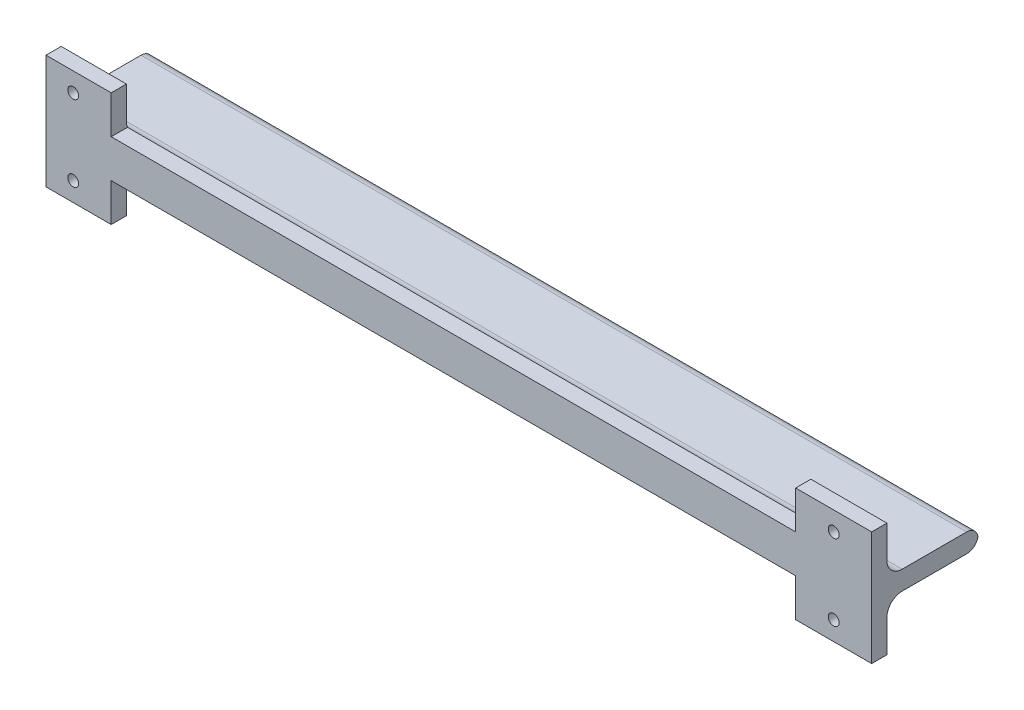
ISO-10303-21;
HEADER;
FILE_DESCRIPTION(('STEP AP214'),'2;1');
FILE_NAME('part.step','',(''),(''),'','','');
FILE_SCHEMA(('AUTOMOTIVE_DESIGN { 1 0 10303 214 1 1 1 1 }'));
ENDSEC;
DATA;
#1=APPLICATION_CONTEXT('core data for automotive mechanical design processes');
#2=APPLICATION_PROTOCOL_DEFINITION('international standard','automotive_design',2000,#1);
#3=PRODUCT_CONTEXT('',#1,'mechanical');
#4=PRODUCT('Part','Part','',(#3));
#5=PRODUCT_RELATED_PRODUCT_CATEGORY('part','',(#4));
#6=PRODUCT_DEFINITION_FORMATION('','',#4);
#7=PRODUCT_DEFINITION_CONTEXT('part definition',#1,'design');
#8=PRODUCT_DEFINITION('design','',#6,#7);
#9=PRODUCT_DEFINITION_SHAPE('','',#8);
#10=(LENGTH_UNIT() NAMED_UNIT(*) SI_UNIT(.MILLI.,.METRE.));
#11=(NAMED_UNIT(*) PLANE_ANGLE_UNIT() SI_UNIT($,.RADIAN.));
#12=(NAMED_UNIT(*) SI_UNIT($,.STERADIAN.) SOLID_ANGLE_UNIT());
#13=UNCERTAINTY_MEASURE_WITH_UNIT(LENGTH_MEASURE(1.E-05),#10,'distance_accuracy_value','');
#14=(GEOMETRIC_REPRESENTATION_CONTEXT(3) GLOBAL_UNCERTAINTY_ASSIGNED_CONTEXT((#13)) GLOBAL_UNIT_ASSIGNED_CONTEXT((#10,
#11,#12)) REPRESENTATION_CONTEXT('',''));
#15=CARTESIAN_POINT('',(0.,0.,0.));
#16=DIRECTION('',(0.,0.,1.));
#17=DIRECTION('',(1.,0.,0.));
#18=AXIS2_PLACEMENT_3D('',#15,#16,#17);
#19=CARTESIAN_POINT('',(0.,0.,-4.));
#20=DIRECTION('',(0.,0.,-1.));
#21=DIRECTION('',(-1.,0.,0.));
#22=AXIS2_PLACEMENT_3D('',#19,#20,#21);
#23=PLANE('',#22);
#24=CARTESIAN_POINT('',(-100.,-9.99999999999998,-4.));
#25=DIRECTION('',(0.,0.,1.));
#26=DIRECTION('',(1.,0.,0.));
#27=AXIS2_PLACEMENT_3D('',#24,#25,#26);
#28=CIRCLE('',#27,1.425);
#29=CARTESIAN_POINT('',(-98.575,-9.99999999999998,-4.));
#30=VERTEX_POINT('',#29);
#31=EDGE_CURVE('E478',#30,#30,#28,.T.);
#32=ORIENTED_EDGE('',*,*,#31,.T.);
#33=EDGE_LOOP('',(#32));
#34=FACE_BOUND('',#33,.T.);
#35=DIRECTION('',(0.,-1.,0.));
#36=VECTOR('',#35,1.);
#37=CARTESIAN_POINT('',(-107.15,-15.,-4.));
#38=LINE('',#37,#36);
#39=CARTESIAN_POINT('',(-107.15,-6.49999999999999,-4.));
#40=VERTEX_POINT('',#39);
#41=CARTESIAN_POINT('',(-107.15,-15.,-4.));
#42=VERTEX_POINT('',#41);
#43=EDGE_CURVE('E226',#40,#42,#38,.T.);
#44=ORIENTED_EDGE('',*,*,#43,.F.);
#45=DIRECTION('',(-1.,0.,0.));
#46=VECTOR('',#45,1.);
#47=CARTESIAN_POINT('',(0.,-6.49999999999999,-4.));
#48=LINE('',#47,#46);
#49=CARTESIAN_POINT('',(-90.,-6.49999999999999,-4.));
#50=VERTEX_POINT('',#49);
#51=EDGE_CURVE('E338',#40,#50,#48,.F.);
#52=ORIENTED_EDGE('',*,*,#51,.T.);
#53=DIRECTION('',(0.,1.,0.));
#54=VECTOR('',#53,1.);
#55=CARTESIAN_POINT('',(-90.,-5.00000000000007,-4.));
#56=LINE('',#55,#54);
#57=CARTESIAN_POINT('',(-90.,-15.,-4.));
#58=VERTEX_POINT('',#57);
#59=EDGE_CURVE('E235',#58,#50,#56,.T.);
#60=ORIENTED_EDGE('',*,*,#59,.F.);
#61=DIRECTION('',(1.,0.,0.));
#62=VECTOR('',#61,1.);
#63=CARTESIAN_POINT('',(-90.,-15.,-4.));
#64=LINE('',#63,#62);
#65=EDGE_CURVE('E231',#42,#58,#64,.T.);
#66=ORIENTED_EDGE('',*,*,#65,.F.);
#67=EDGE_LOOP('',(#44,#52,#60,#66));
#68=FACE_BOUND('',#67,.T.);
#69=ADVANCED_FACE('F39',(#34,#68),#23,.T.);
#70=CARTESIAN_POINT('',(100.,9.99999999999998,-4.));
#71=DIRECTION('',(0.,0.,1.));
#72=DIRECTION('',(1.,0.,0.));
#73=AXIS2_PLACEMENT_3D('',#70,#71,#72);
#74=CIRCLE('',#73,1.425);
#75=CARTESIAN_POINT('',(101.425,9.99999999999998,-4.));
#76=VERTEX_POINT('',#75);
#77=EDGE_CURVE('E253',#76,#76,#74,.T.);
#78=ORIENTED_EDGE('',*,*,#77,.T.);
#79=EDGE_LOOP('',(#78));
#80=FACE_BOUND('',#79,.T.);
#81=DIRECTION('',(0.,1.,0.));
#82=VECTOR('',#81,1.);
#83=CARTESIAN_POINT('',(110.,15.,-4.));
#84=LINE('',#83,#82);
#85=CARTESIAN_POINT('',(110.,6.49999999999999,-4.));
#86=VERTEX_POINT('',#85);
#87=CARTESIAN_POINT('',(110.,15.,-4.));
#88=VERTEX_POINT('',#87);
#89=EDGE_CURVE('E246',#86,#88,#84,.T.);
#90=ORIENTED_EDGE('',*,*,#89,.F.);
#91=DIRECTION('',(1.,0.,0.));
#92=VECTOR('',#91,1.);
#93=CARTESIAN_POINT('',(0.,6.5,-4.));
#94=LINE('',#93,#92);
#95=CARTESIAN_POINT('',(90.,6.5,-4.));
#96=VERTEX_POINT('',#95);
#97=EDGE_CURVE('E202',#86,#96,#94,.F.);
#98=ORIENTED_EDGE('',*,*,#97,.T.);
#99=DIRECTION('',(0.,-1.,0.));
#100=VECTOR('',#99,1.);
#101=CARTESIAN_POINT('',(90.,15.,-4.));
#102=LINE('',#101,#100);
#103=CARTESIAN_POINT('',(90.,15.,-4.));
#104=VERTEX_POINT('',#103);
#105=EDGE_CURVE('E184',#104,#96,#102,.T.);
#106=ORIENTED_EDGE('',*,*,#105,.F.);
#107=DIRECTION('',(-1.,0.,0.));
#108=VECTOR('',#107,1.);
#109=CARTESIAN_POINT('',(90.,15.,-4.));
#110=LINE('',#109,#108);
#111=EDGE_CURVE('E200',#88,#104,#110,.T.);
#112=ORIENTED_EDGE('',*,*,#111,.F.);
#113=EDGE_LOOP('',(#90,#98,#106,#112));
#114=FACE_BOUND('',#113,.T.);
#115=ADVANCED_FACE('F199',(#80,#114),#23,.T.);
#116=DIRECTION('',(0.,-1.,0.));
#117=VECTOR('',#116,1.);
#118=CARTESIAN_POINT('',(90.,-15.,-4.));
#119=LINE('',#118,#117);
#120=CARTESIAN_POINT('',(90.,-6.49999999999999,-4.));
#121=VERTEX_POINT('',#120);
#122=CARTESIAN_POINT('',(90.,-15.,-4.));
#123=VERTEX_POINT('',#122);
#124=EDGE_CURVE('E239',#121,#123,#119,.T.);
#125=ORIENTED_EDGE('',*,*,#124,.F.);
#126=DIRECTION('',(-1.,0.,0.));
#127=VECTOR('',#126,1.);
#128=CARTESIAN_POINT('',(0.,-6.49999999999999,-4.));
#129=LINE('',#128,#127);
#130=CARTESIAN_POINT('',(110.,-6.49999999999998,-4.));
#131=VERTEX_POINT('',#130);
#132=EDGE_CURVE('E335',#121,#131,#129,.F.);
#133=ORIENTED_EDGE('',*,*,#132,.T.);
#134=CARTESIAN_POINT('',(110.,-15.,-4.));
#135=VERTEX_POINT('',#134);
#136=EDGE_CURVE('E194',#135,#131,#84,.T.);
#137=ORIENTED_EDGE('',*,*,#136,.F.);
#138=DIRECTION('',(1.,0.,0.));
#139=VECTOR('',#138,1.);
#140=CARTESIAN_POINT('',(110.,-15.,-4.));
#141=LINE('',#140,#139);
#142=EDGE_CURVE('E242',#123,#135,#141,.T.);
#143=ORIENTED_EDGE('',*,*,#142,.F.);
#144=EDGE_LOOP('',(#125,#133,#137,#143));
#145=FACE_BOUND('',#144,.T.);
#146=CARTESIAN_POINT('',(100.,-9.99999999999998,-4.));
#147=DIRECTION('',(0.,0.,1.));
#148=DIRECTION('',(1.,0.,0.));
#149=AXIS2_PLACEMENT_3D('',#146,#147,#148);
#150=CIRCLE('',#149,1.425);
#151=CARTESIAN_POINT('',(101.425,-9.99999999999998,-4.));
#152=VERTEX_POINT('',#151);
#153=EDGE_CURVE('E486',#152,#152,#150,.T.);
#154=ORIENTED_EDGE('',*,*,#153,.T.);
#155=EDGE_LOOP('',(#154));
#156=FACE_BOUND('',#155,.T.);
#157=ADVANCED_FACE('F513',(#145,#156),#23,.T.);
#158=CARTESIAN_POINT('',(90.,15.,-4.));
#159=DIRECTION('',(0.,1.,0.));
#160=DIRECTION('',(0.,0.,1.));
#161=AXIS2_PLACEMENT_3D('',#158,#159,#160);
#162=PLANE('',#161);
#163=DIRECTION('',(-1.,0.,0.));
#164=VECTOR('',#163,1.);
#165=CARTESIAN_POINT('',(90.,15.,0.));
#166=LINE('',#165,#164);
#167=CARTESIAN_POINT('',(110.,15.,0.));
#168=VERTEX_POINT('',#167);
#169=CARTESIAN_POINT('',(90.,15.,0.));
#170=VERTEX_POINT('',#169);
#171=EDGE_CURVE('E250',#168,#170,#166,.T.);
#172=ORIENTED_EDGE('',*,*,#171,.F.);
#173=DIRECTION('',(0.,0.,1.));
#174=VECTOR('',#173,1.);
#175=CARTESIAN_POINT('',(110.,15.,-4.));
#176=LINE('',#175,#174);
#177=EDGE_CURVE('E208',#88,#168,#176,.T.);
#178=ORIENTED_EDGE('',*,*,#177,.F.);
#179=ORIENTED_EDGE('',*,*,#111,.T.);
#180=DIRECTION('',(0.,0.,1.));
#181=VECTOR('',#180,1.);
#182=CARTESIAN_POINT('',(90.,15.,-4.));
#183=LINE('',#182,#181);
#184=EDGE_CURVE('E180',#104,#170,#183,.T.);
#185=ORIENTED_EDGE('',*,*,#184,.T.);
#186=EDGE_LOOP('',(#172,#178,#179,#185));
#187=FACE_BOUND('',#186,.T.);
#188=ADVANCED_FACE('F207',(#187),#162,.T.);
#189=CARTESIAN_POINT('',(110.,15.,-4.));
#190=DIRECTION('',(1.,0.,0.));
#191=DIRECTION('',(0.,0.,-1.));
#192=AXIS2_PLACEMENT_3D('',#189,#190,#191);
#193=PLANE('',#192);
#194=DIRECTION('',(0.,0.,1.));
#195=VECTOR('',#194,1.);
#196=CARTESIAN_POINT('',(110.,-2.49999999999999,-28.));
#197=LINE('',#196,#195);
#198=CARTESIAN_POINT('',(110.,-2.49999999999999,-25.));
#199=VERTEX_POINT('',#198);
#200=CARTESIAN_POINT('',(110.,-2.49999999999999,-8.));
#201=VERTEX_POINT('',#200);
#202=EDGE_CURVE('E463',#199,#201,#197,.T.);
#203=ORIENTED_EDGE('',*,*,#202,.F.);
#204=CARTESIAN_POINT('',(110.,0.500000000000013,-25.));
#205=DIRECTION('',(1.,0.,0.));
#206=DIRECTION('',(0.,0.,-1.));
#207=AXIS2_PLACEMENT_3D('',#204,#205,#206);
#208=CIRCLE('',#207,3.);
#209=CARTESIAN_POINT('',(110.,0.,-27.9580398915498));
#210=VERTEX_POINT('',#209);
#211=EDGE_CURVE('E49',#199,#210,#208,.T.);
#212=ORIENTED_EDGE('',*,*,#211,.T.);
#213=CARTESIAN_POINT('',(110.,-0.500000000000013,-25.));
#214=DIRECTION('',(1.,0.,0.));
#215=DIRECTION('',(0.,0.,-1.));
#216=AXIS2_PLACEMENT_3D('',#213,#214,#215);
#217=CIRCLE('',#216,3.);
#218=CARTESIAN_POINT('',(110.,2.49999999999999,-25.));
#219=VERTEX_POINT('',#218);
#220=EDGE_CURVE('E59',#210,#219,#217,.T.);
#221=ORIENTED_EDGE('',*,*,#220,.T.);
#222=DIRECTION('',(0.,0.,1.));
#223=VECTOR('',#222,1.);
#224=CARTESIAN_POINT('',(110.,2.49999999999999,-28.));
#225=LINE('',#224,#223);
#226=CARTESIAN_POINT('',(110.,2.49999999999999,-8.));
#227=VERTEX_POINT('',#226);
#228=EDGE_CURVE('E447',#219,#227,#225,.T.);
#229=ORIENTED_EDGE('',*,*,#228,.T.);
#230=CARTESIAN_POINT('',(110.,6.49999999999999,-8.));
#231=DIRECTION('',(1.,0.,0.));
#232=DIRECTION('',(0.,0.,-1.));
#233=AXIS2_PLACEMENT_3D('',#230,#231,#232);
#234=CIRCLE('',#233,4.);
#235=EDGE_CURVE('E341',#227,#86,#234,.F.);
#236=ORIENTED_EDGE('',*,*,#235,.T.);
#237=ORIENTED_EDGE('',*,*,#89,.T.);
#238=ORIENTED_EDGE('',*,*,#177,.T.);
#239=DIRECTION('',(0.,1.,0.));
#240=VECTOR('',#239,1.);
#241=CARTESIAN_POINT('',(110.,15.,0.));
#242=LINE('',#241,#240);
#243=CARTESIAN_POINT('',(110.,-15.,0.));
#244=VERTEX_POINT('',#243);
#245=EDGE_CURVE('E210',#244,#168,#242,.T.);
#246=ORIENTED_EDGE('',*,*,#245,.F.);
#247=DIRECTION('',(0.,0.,1.));
#248=VECTOR('',#247,1.);
#249=CARTESIAN_POINT('',(110.,-15.,-4.));
#250=LINE('',#249,#248);
#251=EDGE_CURVE('E294',#135,#244,#250,.T.);
#252=ORIENTED_EDGE('',*,*,#251,.F.);
#253=ORIENTED_EDGE('',*,*,#136,.T.);
#254=CARTESIAN_POINT('',(110.,-6.49999999999999,-8.));
#255=DIRECTION('',(1.,0.,0.));
#256=DIRECTION('',(0.,0.,-1.));
#257=AXIS2_PLACEMENT_3D('',#254,#255,#256);
#258=CIRCLE('',#257,4.);
#259=EDGE_CURVE('E372',#131,#201,#258,.F.);
#260=ORIENTED_EDGE('',*,*,#259,.T.);
#261=EDGE_LOOP('',(#203,#212,#221,#229,#236,#237,#238,#246,#252,#253,#260));
#262=FACE_BOUND('',#261,.T.);
#263=ADVANCED_FACE('F566',(#262),#193,.T.);
#264=CARTESIAN_POINT('',(110.,-15.,-4.));
#265=DIRECTION('',(0.,-1.,0.));
#266=DIRECTION('',(1.,0.,0.));
#267=AXIS2_PLACEMENT_3D('',#264,#265,#266);
#268=PLANE('',#267);
#269=DIRECTION('',(1.,0.,0.));
#270=VECTOR('',#269,1.);
#271=CARTESIAN_POINT('',(110.,-15.,0.));
#272=LINE('',#271,#270);
#273=CARTESIAN_POINT('',(90.,-15.,0.));
#274=VERTEX_POINT('',#273);
#275=EDGE_CURVE('E214',#274,#244,#272,.T.);
#276=ORIENTED_EDGE('',*,*,#275,.F.);
#277=DIRECTION('',(0.,0.,1.));
#278=VECTOR('',#277,1.);
#279=CARTESIAN_POINT('',(90.,-15.,-4.));
#280=LINE('',#279,#278);
#281=EDGE_CURVE('E297',#123,#274,#280,.T.);
#282=ORIENTED_EDGE('',*,*,#281,.F.);
#283=ORIENTED_EDGE('',*,*,#142,.T.);
#284=ORIENTED_EDGE('',*,*,#251,.T.);
#285=EDGE_LOOP('',(#276,#282,#283,#284));
#286=FACE_BOUND('',#285,.T.);
#287=ADVANCED_FACE('F571',(#286),#268,.T.);
#288=CARTESIAN_POINT('',(90.,-15.,-4.));
#289=DIRECTION('',(-1.,0.,0.));
#290=DIRECTION('',(0.,0.,1.));
#291=AXIS2_PLACEMENT_3D('',#288,#289,#290);
#292=PLANE('',#291);
#293=DIRECTION('',(0.,-1.,0.));
#294=VECTOR('',#293,1.);
#295=CARTESIAN_POINT('',(90.,-15.,0.));
#296=LINE('',#295,#294);
#297=CARTESIAN_POINT('',(90.,-5.00000000000005,0.));
#298=VERTEX_POINT('',#297);
#299=EDGE_CURVE('E284',#298,#274,#296,.T.);
#300=ORIENTED_EDGE('',*,*,#299,.F.);
#301=DIRECTION('',(0.,0.,1.));
#302=VECTOR('',#301,1.);
#303=CARTESIAN_POINT('',(90.,-5.00000000000005,-4.));
#304=LINE('',#303,#302);
#305=CARTESIAN_POINT('',(90.,-5.00000000000005,-4.29190075645214));
#306=VERTEX_POINT('',#305);
#307=EDGE_CURVE('E300',#306,#298,#304,.T.);
#308=ORIENTED_EDGE('',*,*,#307,.F.);
#309=CARTESIAN_POINT('',(90.,-6.49999999999999,-8.));
#310=DIRECTION('',(-1.,0.,0.));
#311=DIRECTION('',(0.,0.,1.));
#312=AXIS2_PLACEMENT_3D('',#309,#310,#311);
#313=CIRCLE('',#312,4.);
#314=EDGE_CURVE('E369',#306,#121,#313,.F.);
#315=ORIENTED_EDGE('',*,*,#314,.T.);
#316=ORIENTED_EDGE('',*,*,#124,.T.);
#317=ORIENTED_EDGE('',*,*,#281,.T.);
#318=EDGE_LOOP('',(#300,#308,#315,#316,#317));
#319=FACE_BOUND('',#318,.T.);
#320=ADVANCED_FACE('F662',(#319),#292,.T.);
#321=CARTESIAN_POINT('',(90.,-5.00000000000005,-4.));
#322=DIRECTION('',(0.,-1.,0.));
#323=DIRECTION('',(1.,0.,0.));
#324=AXIS2_PLACEMENT_3D('',#321,#322,#323);
#325=PLANE('',#324);
#326=DIRECTION('',(1.,0.,0.));
#327=VECTOR('',#326,1.);
#328=CARTESIAN_POINT('',(90.,-5.00000000000005,0.));
#329=LINE('',#328,#327);
#330=CARTESIAN_POINT('',(-90.,-5.00000000000007,0.));
#331=VERTEX_POINT('',#330);
#332=EDGE_CURVE('E280',#331,#298,#329,.T.);
#333=ORIENTED_EDGE('',*,*,#332,.F.);
#334=DIRECTION('',(0.,0.,1.));
#335=VECTOR('',#334,1.);
#336=CARTESIAN_POINT('',(-90.,-5.00000000000007,-4.));
#337=LINE('',#336,#335);
#338=CARTESIAN_POINT('',(-90.,-5.00000000000007,-4.29190075645213));
#339=VERTEX_POINT('',#338);
#340=EDGE_CURVE('E303',#339,#331,#337,.T.);
#341=ORIENTED_EDGE('',*,*,#340,.F.);
#342=DIRECTION('',(-1.,0.,0.));
#343=VECTOR('',#342,1.);
#344=CARTESIAN_POINT('',(-90.,-5.00000000000007,-4.29190075645213));
#345=LINE('',#344,#343);
#346=EDGE_CURVE('E365',#339,#306,#345,.F.);
#347=ORIENTED_EDGE('',*,*,#346,.T.);
#348=ORIENTED_EDGE('',*,*,#307,.T.);
#349=EDGE_LOOP('',(#333,#341,#347,#348));
#350=FACE_BOUND('',#349,.T.);
#351=ADVANCED_FACE('F415',(#350),#325,.T.);
#352=CARTESIAN_POINT('',(-90.,-5.00000000000007,-4.));
#353=DIRECTION('',(1.,0.,0.));
#354=DIRECTION('',(0.,0.,-1.));
#355=AXIS2_PLACEMENT_3D('',#352,#353,#354);
#356=PLANE('',#355);
#357=DIRECTION('',(0.,1.,0.));
#358=VECTOR('',#357,1.);
#359=CARTESIAN_POINT('',(-90.,-5.00000000000007,0.));
#360=LINE('',#359,#358);
#361=CARTESIAN_POINT('',(-90.,-15.,0.));
#362=VERTEX_POINT('',#361);
#363=EDGE_CURVE('E276',#362,#331,#360,.T.);
#364=ORIENTED_EDGE('',*,*,#363,.F.);
#365=DIRECTION('',(0.,0.,1.));
#366=VECTOR('',#365,1.);
#367=CARTESIAN_POINT('',(-90.,-15.,-4.));
#368=LINE('',#367,#366);
#369=EDGE_CURVE('E306',#58,#362,#368,.T.);
#370=ORIENTED_EDGE('',*,*,#369,.F.);
#371=ORIENTED_EDGE('',*,*,#59,.T.);
#372=CARTESIAN_POINT('',(-90.,-6.49999999999999,-8.));
#373=DIRECTION('',(1.,0.,0.));
#374=DIRECTION('',(0.,0.,-1.));
#375=AXIS2_PLACEMENT_3D('',#372,#373,#374);
#376=CIRCLE('',#375,4.);
#377=EDGE_CURVE('E361',#50,#339,#376,.F.);
#378=ORIENTED_EDGE('',*,*,#377,.T.);
#379=ORIENTED_EDGE('',*,*,#340,.T.);
#380=EDGE_LOOP('',(#364,#370,#371,#378,#379));
#381=FACE_BOUND('',#380,.T.);
#382=ADVANCED_FACE('F407',(#381),#356,.T.);
#383=CARTESIAN_POINT('',(-90.,-15.,-4.));
#384=DIRECTION('',(0.,-1.,0.));
#385=DIRECTION('',(0.,0.,-1.));
#386=AXIS2_PLACEMENT_3D('',#383,#384,#385);
#387=PLANE('',#386);
#388=DIRECTION('',(1.,0.,0.));
#389=VECTOR('',#388,1.);
#390=CARTESIAN_POINT('',(-90.,-15.,0.));
#391=LINE('',#390,#389);
#392=CARTESIAN_POINT('',(-107.15,-15.,0.));
#393=VERTEX_POINT('',#392);
#394=EDGE_CURVE('E272',#393,#362,#391,.T.);
#395=ORIENTED_EDGE('',*,*,#394,.F.);
#396=DIRECTION('',(0.,0.,1.));
#397=VECTOR('',#396,1.);
#398=CARTESIAN_POINT('',(-107.15,-15.,-4.));
#399=LINE('',#398,#397);
#400=EDGE_CURVE('E309',#42,#393,#399,.T.);
#401=ORIENTED_EDGE('',*,*,#400,.F.);
#402=ORIENTED_EDGE('',*,*,#65,.T.);
#403=ORIENTED_EDGE('',*,*,#369,.T.);
#404=EDGE_LOOP('',(#395,#401,#402,#403));
#405=FACE_BOUND('',#404,.T.);
#406=ADVANCED_FACE('F402',(#405),#387,.T.);
#407=CARTESIAN_POINT('',(-107.15,-15.,-4.));
#408=DIRECTION('',(-1.,0.,0.));
#409=DIRECTION('',(0.,0.,1.));
#410=AXIS2_PLACEMENT_3D('',#407,#408,#409);
#411=PLANE('',#410);
#412=CARTESIAN_POINT('',(-107.15,-0.499999999999987,-25.));
#413=DIRECTION('',(-1.,0.,0.));
#414=DIRECTION('',(0.,0.,1.));
#415=AXIS2_PLACEMENT_3D('',#412,#413,#414);
#416=CIRCLE('',#415,3.);
#417=CARTESIAN_POINT('',(-107.15,2.50000000000001,-25.));
#418=VERTEX_POINT('',#417);
#419=CARTESIAN_POINT('',(-107.15,0.,-27.9580398915498));
#420=VERTEX_POINT('',#419);
#421=EDGE_CURVE('E376',#418,#420,#416,.T.);
#422=ORIENTED_EDGE('',*,*,#421,.T.);
#423=CARTESIAN_POINT('',(-107.15,0.500000000000013,-25.));
#424=DIRECTION('',(-1.,0.,0.));
#425=DIRECTION('',(0.,0.,1.));
#426=AXIS2_PLACEMENT_3D('',#423,#424,#425);
#427=CIRCLE('',#426,3.);
#428=CARTESIAN_POINT('',(-107.15,-2.49999999999999,-25.));
#429=VERTEX_POINT('',#428);
#430=EDGE_CURVE('E379',#420,#429,#427,.T.);
#431=ORIENTED_EDGE('',*,*,#430,.T.);
#432=DIRECTION('',(0.,0.,1.));
#433=VECTOR('',#432,1.);
#434=CARTESIAN_POINT('',(-107.15,-2.49999999999999,-28.));
#435=LINE('',#434,#433);
#436=CARTESIAN_POINT('',(-107.15,-2.49999999999999,-8.));
#437=VERTEX_POINT('',#436);
#438=EDGE_CURVE('E455',#429,#437,#435,.T.);
#439=ORIENTED_EDGE('',*,*,#438,.T.);
#440=CARTESIAN_POINT('',(-107.15,-6.49999999999999,-8.));
#441=DIRECTION('',(-1.,0.,0.));
#442=DIRECTION('',(0.,0.,1.));
#443=AXIS2_PLACEMENT_3D('',#440,#441,#442);
#444=CIRCLE('',#443,4.);
#445=EDGE_CURVE('E358',#437,#40,#444,.F.);
#446=ORIENTED_EDGE('',*,*,#445,.T.);
#447=ORIENTED_EDGE('',*,*,#43,.T.);
#448=ORIENTED_EDGE('',*,*,#400,.T.);
#449=DIRECTION('',(0.,-1.,0.));
#450=VECTOR('',#449,1.);
#451=CARTESIAN_POINT('',(-107.15,-15.,0.));
#452=LINE('',#451,#450);
#453=CARTESIAN_POINT('',(-107.15,15.,0.));
#454=VERTEX_POINT('',#453);
#455=EDGE_CURVE('E268',#454,#393,#452,.T.);
#456=ORIENTED_EDGE('',*,*,#455,.F.);
#457=DIRECTION('',(0.,0.,1.));
#458=VECTOR('',#457,1.);
#459=CARTESIAN_POINT('',(-107.15,15.,-4.));
#460=LINE('',#459,#458);
#461=CARTESIAN_POINT('',(-107.15,15.,-4.));
#462=VERTEX_POINT('',#461);
#463=EDGE_CURVE('E312',#462,#454,#460,.T.);
#464=ORIENTED_EDGE('',*,*,#463,.F.);
#465=CARTESIAN_POINT('',(-107.15,6.50000000000001,-4.));
#466=VERTEX_POINT('',#465);
#467=EDGE_CURVE('E227',#462,#466,#38,.T.);
#468=ORIENTED_EDGE('',*,*,#467,.T.);
#469=CARTESIAN_POINT('',(-107.15,6.50000000000001,-8.));
#470=DIRECTION('',(-1.,0.,0.));
#471=DIRECTION('',(0.,0.,1.));
#472=AXIS2_PLACEMENT_3D('',#469,#470,#471);
#473=CIRCLE('',#472,4.);
#474=CARTESIAN_POINT('',(-107.15,2.50000000000001,-8.));
#475=VERTEX_POINT('',#474);
#476=EDGE_CURVE('E354',#466,#475,#473,.F.);
#477=ORIENTED_EDGE('',*,*,#476,.T.);
#478=DIRECTION('',(0.,0.,1.));
#479=VECTOR('',#478,1.);
#480=CARTESIAN_POINT('',(-107.15,2.50000000000001,-28.));
#481=LINE('',#480,#479);
#482=EDGE_CURVE('E441',#418,#475,#481,.T.);
#483=ORIENTED_EDGE('',*,*,#482,.F.);
#484=EDGE_LOOP('',(#422,#431,#439,#446,#447,#448,#456,#464,#468,#477,#483));
#485=FACE_BOUND('',#484,.T.);
#486=ADVANCED_FACE('F394',(#485),#411,.T.);
#487=CARTESIAN_POINT('',(-107.15,15.,-4.));
#488=DIRECTION('',(0.,1.,0.));
#489=DIRECTION('',(-1.,0.,0.));
#490=AXIS2_PLACEMENT_3D('',#487,#488,#489);
#491=PLANE('',#490);
#492=DIRECTION('',(-1.,0.,0.));
#493=VECTOR('',#492,1.);
#494=CARTESIAN_POINT('',(-107.15,15.,0.));
#495=LINE('',#494,#493);
#496=CARTESIAN_POINT('',(-90.,14.9999999999999,0.));
#497=VERTEX_POINT('',#496);
#498=EDGE_CURVE('E264',#497,#454,#495,.T.);
#499=ORIENTED_EDGE('',*,*,#498,.F.);
#500=DIRECTION('',(0.,0.,1.));
#501=VECTOR('',#500,1.);
#502=CARTESIAN_POINT('',(-90.,14.9999999999999,-4.));
#503=LINE('',#502,#501);
#504=CARTESIAN_POINT('',(-90.,14.9999999999999,-4.));
#505=VERTEX_POINT('',#504);
#506=EDGE_CURVE('E315',#505,#497,#503,.T.);
#507=ORIENTED_EDGE('',*,*,#506,.F.);
#508=DIRECTION('',(-1.,0.,0.));
#509=VECTOR('',#508,1.);
#510=CARTESIAN_POINT('',(-107.15,15.,-4.));
#511=LINE('',#510,#509);
#512=EDGE_CURVE('E222',#505,#462,#511,.T.);
#513=ORIENTED_EDGE('',*,*,#512,.T.);
#514=ORIENTED_EDGE('',*,*,#463,.T.);
#515=EDGE_LOOP('',(#499,#507,#513,#514));
#516=FACE_BOUND('',#515,.T.);
#517=ADVANCED_FACE('F430',(#516),#491,.T.);
#518=CARTESIAN_POINT('',(-90.,4.99999999999996,-4.));
#519=DIRECTION('',(1.,0.,0.));
#520=DIRECTION('',(0.,0.,-1.));
#521=AXIS2_PLACEMENT_3D('',#518,#519,#520);
#522=PLANE('',#521);
#523=DIRECTION('',(0.,1.,0.));
#524=VECTOR('',#523,1.);
#525=CARTESIAN_POINT('',(-90.,4.99999999999996,0.));
#526=LINE('',#525,#524);
#527=CARTESIAN_POINT('',(-90.,4.99999999999996,0.));
#528=VERTEX_POINT('',#527);
#529=EDGE_CURVE('E260',#528,#497,#526,.T.);
#530=ORIENTED_EDGE('',*,*,#529,.F.);
#531=DIRECTION('',(0.,0.,1.));
#532=VECTOR('',#531,1.);
#533=CARTESIAN_POINT('',(-90.,4.99999999999996,-4.));
#534=LINE('',#533,#532);
#535=CARTESIAN_POINT('',(-90.,4.99999999999996,-4.29190075645219));
#536=VERTEX_POINT('',#535);
#537=EDGE_CURVE('E318',#536,#528,#534,.T.);
#538=ORIENTED_EDGE('',*,*,#537,.F.);
#539=CARTESIAN_POINT('',(-90.,6.50000000000001,-8.));
#540=DIRECTION('',(1.,0.,0.));
#541=DIRECTION('',(0.,0.,-1.));
#542=AXIS2_PLACEMENT_3D('',#539,#540,#541);
#543=CIRCLE('',#542,4.);
#544=CARTESIAN_POINT('',(-90.,6.5,-4.));
#545=VERTEX_POINT('',#544);
#546=EDGE_CURVE('E351',#536,#545,#543,.F.);
#547=ORIENTED_EDGE('',*,*,#546,.T.);
#548=DIRECTION('',(0.,1.,0.));
#549=VECTOR('',#548,1.);
#550=CARTESIAN_POINT('',(-90.,4.99999999999996,-4.));
#551=LINE('',#550,#549);
#552=EDGE_CURVE('E204',#545,#505,#551,.T.);
#553=ORIENTED_EDGE('',*,*,#552,.T.);
#554=ORIENTED_EDGE('',*,*,#506,.T.);
#555=EDGE_LOOP('',(#530,#538,#547,#553,#554));
#556=FACE_BOUND('',#555,.T.);
#557=ADVANCED_FACE('F433',(#556),#522,.T.);
#558=CARTESIAN_POINT('',(90.,4.99999999999998,-4.));
#559=DIRECTION('',(0.,1.,0.));
#560=DIRECTION('',(-1.,0.,0.));
#561=AXIS2_PLACEMENT_3D('',#558,#559,#560);
#562=PLANE('',#561);
#563=DIRECTION('',(-1.,0.,0.));
#564=VECTOR('',#563,1.);
#565=CARTESIAN_POINT('',(90.,4.99999999999998,0.));
#566=LINE('',#565,#564);
#567=CARTESIAN_POINT('',(90.,4.99999999999998,0.));
#568=VERTEX_POINT('',#567);
#569=EDGE_CURVE('E256',#568,#528,#566,.T.);
#570=ORIENTED_EDGE('',*,*,#569,.F.);
#571=DIRECTION('',(0.,0.,1.));
#572=VECTOR('',#571,1.);
#573=CARTESIAN_POINT('',(90.,4.99999999999998,-4.));
#574=LINE('',#573,#572);
#575=CARTESIAN_POINT('',(90.,4.99999999999998,-4.29190075645217));
#576=VERTEX_POINT('',#575);
#577=EDGE_CURVE('E193',#576,#568,#574,.T.);
#578=ORIENTED_EDGE('',*,*,#577,.F.);
#579=DIRECTION('',(1.,0.,0.));
#580=VECTOR('',#579,1.);
#581=CARTESIAN_POINT('',(90.,4.99999999999998,-4.29190075645217));
#582=LINE('',#581,#580);
#583=EDGE_CURVE('E347',#576,#536,#582,.F.);
#584=ORIENTED_EDGE('',*,*,#583,.T.);
#585=ORIENTED_EDGE('',*,*,#537,.T.);
#586=EDGE_LOOP('',(#570,#578,#584,#585));
#587=FACE_BOUND('',#586,.T.);
#588=ADVANCED_FACE('F706',(#587),#562,.T.);
#589=CARTESIAN_POINT('',(90.,15.,-4.));
#590=DIRECTION('',(-1.,0.,0.));
#591=DIRECTION('',(0.,0.,1.));
#592=AXIS2_PLACEMENT_3D('',#589,#590,#591);
#593=PLANE('',#592);
#594=DIRECTION('',(0.,-1.,0.));
#595=VECTOR('',#594,1.);
#596=CARTESIAN_POINT('',(90.,15.,0.));
#597=LINE('',#596,#595);
#598=EDGE_CURVE('E187',#170,#568,#597,.T.);
#599=ORIENTED_EDGE('',*,*,#598,.F.);
#600=ORIENTED_EDGE('',*,*,#184,.F.);
#601=ORIENTED_EDGE('',*,*,#105,.T.);
#602=CARTESIAN_POINT('',(90.,6.49999999999999,-8.));
#603=DIRECTION('',(-1.,0.,0.));
#604=DIRECTION('',(0.,0.,1.));
#605=AXIS2_PLACEMENT_3D('',#602,#603,#604);
#606=CIRCLE('',#605,4.);
#607=EDGE_CURVE('E344',#96,#576,#606,.F.);
#608=ORIENTED_EDGE('',*,*,#607,.T.);
#609=ORIENTED_EDGE('',*,*,#577,.T.);
#610=EDGE_LOOP('',(#599,#600,#601,#608,#609));
#611=FACE_BOUND('',#610,.T.);
#612=ADVANCED_FACE('F182',(#611),#593,.T.);
#613=ORIENTED_EDGE('',*,*,#552,.F.);
#614=DIRECTION('',(1.,0.,0.));
#615=VECTOR('',#614,1.);
#616=CARTESIAN_POINT('',(0.,6.5,-4.));
#617=LINE('',#616,#615);
#618=EDGE_CURVE('E326',#545,#466,#617,.F.);
#619=ORIENTED_EDGE('',*,*,#618,.T.);
#620=ORIENTED_EDGE('',*,*,#467,.F.);
#621=ORIENTED_EDGE('',*,*,#512,.F.);
#622=EDGE_LOOP('',(#613,#619,#620,#621));
#623=FACE_BOUND('',#622,.T.);
#624=CARTESIAN_POINT('',(-100.,9.99999999999998,-4.));
#625=DIRECTION('',(0.,0.,1.));
#626=DIRECTION('',(1.,0.,0.));
#627=AXIS2_PLACEMENT_3D('',#624,#625,#626);
#628=CIRCLE('',#627,1.425);
#629=CARTESIAN_POINT('',(-98.575,9.99999999999998,-4.));
#630=VERTEX_POINT('',#629);
#631=EDGE_CURVE('E470',#630,#630,#628,.T.);
#632=ORIENTED_EDGE('',*,*,#631,.T.);
#633=EDGE_LOOP('',(#632));
#634=FACE_BOUND('',#633,.T.);
#635=ADVANCED_FACE('F426',(#623,#634),#23,.T.);
#636=CARTESIAN_POINT('',(0.,0.,0.));
#637=DIRECTION('',(0.,0.,-1.));
#638=DIRECTION('',(-1.,0.,0.));
#639=AXIS2_PLACEMENT_3D('',#636,#637,#638);
#640=PLANE('',#639);
#641=CARTESIAN_POINT('',(-100.,9.99999999999998,0.));
#642=DIRECTION('',(0.,0.,1.));
#643=DIRECTION('',(1.,0.,0.));
#644=AXIS2_PLACEMENT_3D('',#641,#642,#643);
#645=CIRCLE('',#644,1.425);
#646=CARTESIAN_POINT('',(-98.575,9.99999999999998,0.));
#647=VERTEX_POINT('',#646);
#648=EDGE_CURVE('E446',#647,#647,#645,.T.);
#649=ORIENTED_EDGE('',*,*,#648,.F.);
#650=EDGE_LOOP('',(#649));
#651=FACE_BOUND('',#650,.T.);
#652=CARTESIAN_POINT('',(-100.,-9.99999999999998,0.));
#653=DIRECTION('',(0.,0.,1.));
#654=DIRECTION('',(1.,0.,0.));
#655=AXIS2_PLACEMENT_3D('',#652,#653,#654);
#656=CIRCLE('',#655,1.425);
#657=CARTESIAN_POINT('',(-98.575,-9.99999999999998,0.));
#658=VERTEX_POINT('',#657);
#659=EDGE_CURVE('E474',#658,#658,#656,.T.);
#660=ORIENTED_EDGE('',*,*,#659,.F.);
#661=EDGE_LOOP('',(#660));
#662=FACE_BOUND('',#661,.T.);
#663=CARTESIAN_POINT('',(100.,-9.99999999999998,0.));
#664=DIRECTION('',(0.,0.,1.));
#665=DIRECTION('',(1.,0.,0.));
#666=AXIS2_PLACEMENT_3D('',#663,#664,#665);
#667=CIRCLE('',#666,1.425);
#668=CARTESIAN_POINT('',(101.425,-9.99999999999998,0.));
#669=VERTEX_POINT('',#668);
#670=EDGE_CURVE('E482',#669,#669,#667,.T.);
#671=ORIENTED_EDGE('',*,*,#670,.F.);
#672=EDGE_LOOP('',(#671));
#673=FACE_BOUND('',#672,.T.);
#674=CARTESIAN_POINT('',(100.,9.99999999999998,0.));
#675=DIRECTION('',(0.,0.,1.));
#676=DIRECTION('',(1.,0.,0.));
#677=AXIS2_PLACEMENT_3D('',#674,#675,#676);
#678=CIRCLE('',#677,1.425);
#679=CARTESIAN_POINT('',(101.425,9.99999999999998,0.));
#680=VERTEX_POINT('',#679);
#681=EDGE_CURVE('E217',#680,#680,#678,.T.);
#682=ORIENTED_EDGE('',*,*,#681,.F.);
#683=EDGE_LOOP('',(#682));
#684=FACE_BOUND('',#683,.T.);
#685=ORIENTED_EDGE('',*,*,#171,.T.);
#686=ORIENTED_EDGE('',*,*,#598,.T.);
#687=ORIENTED_EDGE('',*,*,#569,.T.);
#688=ORIENTED_EDGE('',*,*,#529,.T.);
#689=ORIENTED_EDGE('',*,*,#498,.T.);
#690=ORIENTED_EDGE('',*,*,#455,.T.);
#691=ORIENTED_EDGE('',*,*,#394,.T.);
#692=ORIENTED_EDGE('',*,*,#363,.T.);
#693=ORIENTED_EDGE('',*,*,#332,.T.);
#694=ORIENTED_EDGE('',*,*,#299,.T.);
#695=ORIENTED_EDGE('',*,*,#275,.T.);
#696=ORIENTED_EDGE('',*,*,#245,.T.);
#697=EDGE_LOOP('',(#685,#686,#687,#688,#689,#690,#691,#692,#693,#694,#695,#696));
#698=FACE_BOUND('',#697,.T.);
#699=ADVANCED_FACE('F418',(#651,#662,#673,#684,#698),#640,.F.);
#700=CARTESIAN_POINT('',(100.,9.99999999999998,-4.));
#701=DIRECTION('',(0.,0.,1.));
#702=DIRECTION('',(1.,0.,0.));
#703=AXIS2_PLACEMENT_3D('',#700,#701,#702);
#704=CYLINDRICAL_SURFACE('',#703,1.425);
#705=ORIENTED_EDGE('',*,*,#77,.F.);
#706=EDGE_LOOP('',(#705));
#707=FACE_BOUND('',#706,.T.);
#708=ORIENTED_EDGE('',*,*,#681,.T.);
#709=EDGE_LOOP('',(#708));
#710=FACE_BOUND('',#709,.T.);
#711=ADVANCED_FACE('F500',(#707,#710),#704,.F.);
#712=CARTESIAN_POINT('',(100.,-9.99999999999998,-4.));
#713=DIRECTION('',(0.,0.,1.));
#714=DIRECTION('',(1.,0.,0.));
#715=AXIS2_PLACEMENT_3D('',#712,#713,#714);
#716=CYLINDRICAL_SURFACE('',#715,1.425);
#717=ORIENTED_EDGE('',*,*,#153,.F.);
#718=EDGE_LOOP('',(#717));
#719=FACE_BOUND('',#718,.T.);
#720=ORIENTED_EDGE('',*,*,#670,.T.);
#721=EDGE_LOOP('',(#720));
#722=FACE_BOUND('',#721,.T.);
#723=ADVANCED_FACE('F509',(#719,#722),#716,.F.);
#724=CARTESIAN_POINT('',(-100.,-9.99999999999998,-4.));
#725=DIRECTION('',(0.,0.,1.));
#726=DIRECTION('',(1.,0.,0.));
#727=AXIS2_PLACEMENT_3D('',#724,#725,#726);
#728=CYLINDRICAL_SURFACE('',#727,1.425);
#729=ORIENTED_EDGE('',*,*,#31,.F.);
#730=EDGE_LOOP('',(#729));
#731=FACE_BOUND('',#730,.T.);
#732=ORIENTED_EDGE('',*,*,#659,.T.);
#733=EDGE_LOOP('',(#732));
#734=FACE_BOUND('',#733,.T.);
#735=ADVANCED_FACE('F525',(#731,#734),#728,.F.);
#736=CARTESIAN_POINT('',(-100.,9.99999999999998,-4.));
#737=DIRECTION('',(0.,0.,1.));
#738=DIRECTION('',(1.,0.,0.));
#739=AXIS2_PLACEMENT_3D('',#736,#737,#738);
#740=CYLINDRICAL_SURFACE('',#739,1.425);
#741=ORIENTED_EDGE('',*,*,#631,.F.);
#742=EDGE_LOOP('',(#741));
#743=FACE_BOUND('',#742,.T.);
#744=ORIENTED_EDGE('',*,*,#648,.T.);
#745=EDGE_LOOP('',(#744));
#746=FACE_BOUND('',#745,.T.);
#747=ADVANCED_FACE('F529',(#743,#746),#740,.F.);
#748=CARTESIAN_POINT('',(-107.15,2.50000000000001,-28.));
#749=DIRECTION('',(0.,-1.,0.));
#750=DIRECTION('',(1.,0.,0.));
#751=AXIS2_PLACEMENT_3D('',#748,#749,#750);
#752=PLANE('',#751);
#753=ORIENTED_EDGE('',*,*,#228,.F.);
#754=DIRECTION('',(1.,0.,0.));
#755=VECTOR('',#754,1.);
#756=CARTESIAN_POINT('',(-107.15,2.50000000000001,-25.));
#757=LINE('',#756,#755);
#758=EDGE_CURVE('E11',#219,#418,#757,.F.);
#759=ORIENTED_EDGE('',*,*,#758,.T.);
#760=ORIENTED_EDGE('',*,*,#482,.T.);
#761=DIRECTION('',(1.,0.,0.));
#762=VECTOR('',#761,1.);
#763=CARTESIAN_POINT('',(-107.15,2.50000000000001,-8.));
#764=LINE('',#763,#762);
#765=EDGE_CURVE('E293',#475,#227,#764,.T.);
#766=ORIENTED_EDGE('',*,*,#765,.T.);
#767=EDGE_LOOP('',(#753,#759,#760,#766));
#768=FACE_BOUND('',#767,.T.);
#769=ADVANCED_FACE('F533',(#768),#752,.F.);
#770=CARTESIAN_POINT('',(110.,-2.49999999999999,-28.));
#771=DIRECTION('',(0.,1.,0.));
#772=DIRECTION('',(0.,0.,1.));
#773=AXIS2_PLACEMENT_3D('',#770,#771,#772);
#774=PLANE('',#773);
#775=ORIENTED_EDGE('',*,*,#438,.F.);
#776=DIRECTION('',(-1.,0.,0.));
#777=VECTOR('',#776,1.);
#778=CARTESIAN_POINT('',(110.,-2.49999999999999,-25.));
#779=LINE('',#778,#777);
#780=EDGE_CURVE('E382',#429,#199,#779,.F.);
#781=ORIENTED_EDGE('',*,*,#780,.T.);
#782=ORIENTED_EDGE('',*,*,#202,.T.);
#783=DIRECTION('',(-1.,0.,0.));
#784=VECTOR('',#783,1.);
#785=CARTESIAN_POINT('',(110.,-2.49999999999999,-8.));
#786=LINE('',#785,#784);
#787=EDGE_CURVE('E331',#201,#437,#786,.T.);
#788=ORIENTED_EDGE('',*,*,#787,.T.);
#789=EDGE_LOOP('',(#775,#781,#782,#788));
#790=FACE_BOUND('',#789,.T.);
#791=ADVANCED_FACE('F460',(#790),#774,.F.);
#792=CARTESIAN_POINT('',(-107.15,6.50000000000001,-8.));
#793=DIRECTION('',(1.,0.,0.));
#794=DIRECTION('',(0.,1.,0.));
#795=AXIS2_PLACEMENT_3D('',#792,#793,#794);
#796=CYLINDRICAL_SURFACE('',#795,4.);
#797=ORIENTED_EDGE('',*,*,#607,.F.);
#798=ORIENTED_EDGE('',*,*,#97,.F.);
#799=ORIENTED_EDGE('',*,*,#235,.F.);
#800=ORIENTED_EDGE('',*,*,#765,.F.);
#801=ORIENTED_EDGE('',*,*,#476,.F.);
#802=ORIENTED_EDGE('',*,*,#618,.F.);
#803=ORIENTED_EDGE('',*,*,#546,.F.);
#804=ORIENTED_EDGE('',*,*,#583,.F.);
#805=EDGE_LOOP('',(#797,#798,#799,#800,#801,#802,#803,#804));
#806=FACE_BOUND('',#805,.T.);
#807=ADVANCED_FACE('F436',(#806),#796,.F.);
#808=CARTESIAN_POINT('',(110.,-6.49999999999999,-8.));
#809=DIRECTION('',(-1.,0.,0.));
#810=DIRECTION('',(0.,0.,1.));
#811=AXIS2_PLACEMENT_3D('',#808,#809,#810);
#812=CYLINDRICAL_SURFACE('',#811,4.);
#813=ORIENTED_EDGE('',*,*,#377,.F.);
#814=ORIENTED_EDGE('',*,*,#51,.F.);
#815=ORIENTED_EDGE('',*,*,#445,.F.);
#816=ORIENTED_EDGE('',*,*,#787,.F.);
#817=ORIENTED_EDGE('',*,*,#259,.F.);
#818=ORIENTED_EDGE('',*,*,#132,.F.);
#819=ORIENTED_EDGE('',*,*,#314,.F.);
#820=ORIENTED_EDGE('',*,*,#346,.F.);
#821=EDGE_LOOP('',(#813,#814,#815,#816,#817,#818,#819,#820));
#822=FACE_BOUND('',#821,.T.);
#823=ADVANCED_FACE('F410',(#822),#812,.F.);
#824=CARTESIAN_POINT('',(0.,-0.5,-25.));
#825=DIRECTION('',(-1.,0.,0.));
#826=DIRECTION('',(0.,-1.,0.));
#827=AXIS2_PLACEMENT_3D('',#824,#825,#826);
#828=CYLINDRICAL_SURFACE('',#827,3.);
#829=ORIENTED_EDGE('',*,*,#758,.F.);
#830=ORIENTED_EDGE('',*,*,#220,.F.);
#831=DIRECTION('',(-1.,0.,0.));
#832=VECTOR('',#831,1.);
#833=CARTESIAN_POINT('',(1.425,0.,-27.9580398915498));
#834=LINE('',#833,#832);
#835=EDGE_CURVE('E43',#420,#210,#834,.F.);
#836=ORIENTED_EDGE('',*,*,#835,.F.);
#837=ORIENTED_EDGE('',*,*,#421,.F.);
#838=EDGE_LOOP('',(#829,#830,#836,#837));
#839=FACE_BOUND('',#838,.T.);
#840=ADVANCED_FACE('F41',(#839),#828,.T.);
#841=CARTESIAN_POINT('',(0.,0.500000000000013,-25.));
#842=DIRECTION('',(1.,0.,0.));
#843=DIRECTION('',(0.,0.,-1.));
#844=AXIS2_PLACEMENT_3D('',#841,#842,#843);
#845=CYLINDRICAL_SURFACE('',#844,3.);
#846=ORIENTED_EDGE('',*,*,#211,.F.);
#847=ORIENTED_EDGE('',*,*,#780,.F.);
#848=ORIENTED_EDGE('',*,*,#430,.F.);
#849=ORIENTED_EDGE('',*,*,#835,.T.);
#850=EDGE_LOOP('',(#846,#847,#848,#849));
#851=FACE_BOUND('',#850,.T.);
#852=ADVANCED_FACE('F457',(#851),#845,.T.);
#853=CLOSED_SHELL('',(#69,#115,#157,#188,#263,#287,#320,#351,#382,#406,#486,#517,#557,#588,#612,
#635,#699,#711,#723,#735,#747,#769,#791,#807,#823,#840,#852));
#854=MANIFOLD_SOLID_BREP('B2',#853);
#855=ADVANCED_BREP_SHAPE_REPRESENTATION('',(#18,#854),#14);
#856=SHAPE_DEFINITION_REPRESENTATION(#9,#855);
ENDSEC;
END-ISO-10303-21;
